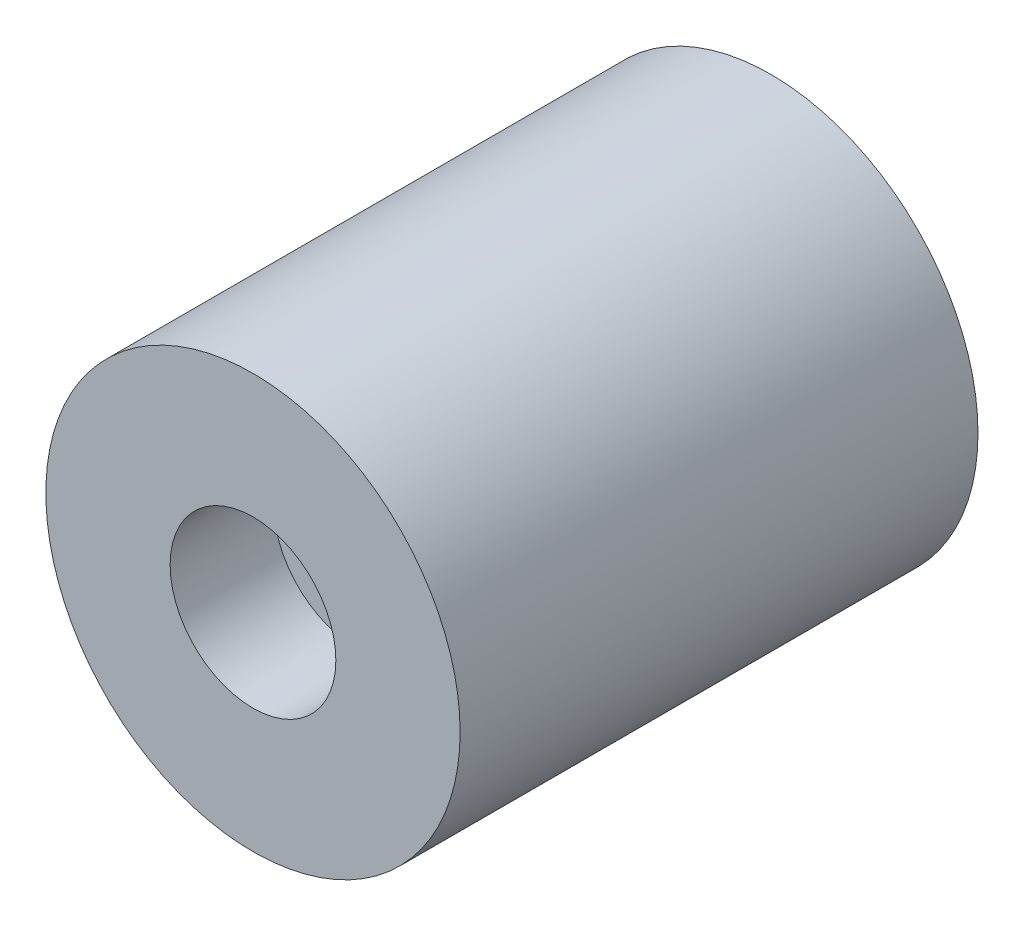
ISO-10303-21;
HEADER;
FILE_DESCRIPTION(('STEP AP214'),'2;1');
FILE_NAME('part.step','',(''),(''),'','','');
FILE_SCHEMA(('AUTOMOTIVE_DESIGN { 1 0 10303 214 1 1 1 1 }'));
ENDSEC;
DATA;
#1=APPLICATION_CONTEXT('core data for automotive mechanical design processes');
#2=APPLICATION_PROTOCOL_DEFINITION('international standard','automotive_design',2000,#1);
#3=PRODUCT_CONTEXT('',#1,'mechanical');
#4=PRODUCT('Part','Part','',(#3));
#5=PRODUCT_RELATED_PRODUCT_CATEGORY('part','',(#4));
#6=PRODUCT_DEFINITION_FORMATION('','',#4);
#7=PRODUCT_DEFINITION_CONTEXT('part definition',#1,'design');
#8=PRODUCT_DEFINITION('design','',#6,#7);
#9=PRODUCT_DEFINITION_SHAPE('','',#8);
#10=(LENGTH_UNIT() NAMED_UNIT(*) SI_UNIT(.MILLI.,.METRE.));
#11=(NAMED_UNIT(*) PLANE_ANGLE_UNIT() SI_UNIT($,.RADIAN.));
#12=(NAMED_UNIT(*) SI_UNIT($,.STERADIAN.) SOLID_ANGLE_UNIT());
#13=UNCERTAINTY_MEASURE_WITH_UNIT(LENGTH_MEASURE(1.E-05),#10,'distance_accuracy_value','');
#14=(GEOMETRIC_REPRESENTATION_CONTEXT(3) GLOBAL_UNCERTAINTY_ASSIGNED_CONTEXT((#13)) GLOBAL_UNIT_ASSIGNED_CONTEXT((#10,
#11,#12)) REPRESENTATION_CONTEXT('',''));
#15=CARTESIAN_POINT('',(0.,0.,0.));
#16=DIRECTION('',(0.,0.,1.));
#17=DIRECTION('',(1.,0.,0.));
#18=AXIS2_PLACEMENT_3D('',#15,#16,#17);
#19=CARTESIAN_POINT('',(0.,0.,-7.5));
#20=DIRECTION('',(0.,0.,1.));
#21=DIRECTION('',(1.,0.,0.));
#22=AXIS2_PLACEMENT_3D('',#19,#20,#21);
#23=PLANE('',#22);
#24=CARTESIAN_POINT('',(0.,0.,-7.5));
#25=DIRECTION('',(0.,0.,1.));
#26=DIRECTION('',(1.,0.,0.));
#27=AXIS2_PLACEMENT_3D('',#24,#25,#26);
#28=CIRCLE('',#27,4.);
#29=CARTESIAN_POINT('',(4.,0.,-7.5));
#30=VERTEX_POINT('',#29);
#31=EDGE_CURVE('E10',#30,#30,#28,.T.);
#32=ORIENTED_EDGE('',*,*,#31,.F.);
#33=EDGE_LOOP('',(#32));
#34=FACE_BOUND('',#33,.T.);
#35=ADVANCED_FACE('F33',(#34),#23,.F.);
#36=CARTESIAN_POINT('',(0.,0.,-12.5));
#37=DIRECTION('',(0.,0.,1.));
#38=DIRECTION('',(1.,0.,0.));
#39=AXIS2_PLACEMENT_3D('',#36,#37,#38);
#40=CYLINDRICAL_SURFACE('',#39,4.);
#41=CARTESIAN_POINT('',(0.,0.,-12.5));
#42=DIRECTION('',(0.,0.,1.));
#43=DIRECTION('',(1.,0.,0.));
#44=AXIS2_PLACEMENT_3D('',#41,#42,#43);
#45=CIRCLE('',#44,4.);
#46=CARTESIAN_POINT('',(4.,0.,-12.5));
#47=VERTEX_POINT('',#46);
#48=EDGE_CURVE('E48',#47,#47,#45,.T.);
#49=ORIENTED_EDGE('',*,*,#48,.F.);
#50=EDGE_LOOP('',(#49));
#51=FACE_BOUND('',#50,.T.);
#52=ORIENTED_EDGE('',*,*,#31,.T.);
#53=EDGE_LOOP('',(#52));
#54=FACE_BOUND('',#53,.T.);
#55=ADVANCED_FACE('F71',(#51,#54),#40,.F.);
#56=CARTESIAN_POINT('',(0.,0.,-12.5));
#57=DIRECTION('',(0.,0.,1.));
#58=DIRECTION('',(1.,0.,0.));
#59=AXIS2_PLACEMENT_3D('',#56,#57,#58);
#60=PLANE('',#59);
#61=ORIENTED_EDGE('',*,*,#48,.T.);
#62=EDGE_LOOP('',(#61));
#63=FACE_BOUND('',#62,.T.);
#64=CARTESIAN_POINT('',(0.,0.,-12.5));
#65=DIRECTION('',(0.,0.,1.));
#66=DIRECTION('',(1.,0.,0.));
#67=AXIS2_PLACEMENT_3D('',#64,#65,#66);
#68=CIRCLE('',#67,10.);
#69=CARTESIAN_POINT('',(10.,0.,-12.5));
#70=VERTEX_POINT('',#69);
#71=EDGE_CURVE('E44',#70,#70,#68,.T.);
#72=ORIENTED_EDGE('',*,*,#71,.F.);
#73=EDGE_LOOP('',(#72));
#74=FACE_BOUND('',#73,.T.);
#75=ADVANCED_FACE('F72',(#63,#74),#60,.F.);
#76=CARTESIAN_POINT('',(0.,0.,-7.5));
#77=DIRECTION('',(0.,0.,1.));
#78=DIRECTION('',(1.,0.,0.));
#79=AXIS2_PLACEMENT_3D('',#76,#77,#78);
#80=CYLINDRICAL_SURFACE('',#79,10.);
#81=CARTESIAN_POINT('',(0.,0.,12.5));
#82=DIRECTION('',(0.,0.,1.));
#83=DIRECTION('',(1.,0.,0.));
#84=AXIS2_PLACEMENT_3D('',#81,#82,#83);
#85=CIRCLE('',#84,10.);
#86=CARTESIAN_POINT('',(10.,0.,12.5));
#87=VERTEX_POINT('',#86);
#88=EDGE_CURVE('E51',#87,#87,#85,.T.);
#89=ORIENTED_EDGE('',*,*,#88,.F.);
#90=EDGE_LOOP('',(#89));
#91=FACE_BOUND('',#90,.T.);
#92=ORIENTED_EDGE('',*,*,#71,.T.);
#93=EDGE_LOOP('',(#92));
#94=FACE_BOUND('',#93,.T.);
#95=ADVANCED_FACE('F35',(#91,#94),#80,.T.);
#96=CARTESIAN_POINT('',(0.,0.,12.5));
#97=DIRECTION('',(0.,0.,1.));
#98=DIRECTION('',(1.,0.,0.));
#99=AXIS2_PLACEMENT_3D('',#96,#97,#98);
#100=PLANE('',#99);
#101=ORIENTED_EDGE('',*,*,#88,.T.);
#102=EDGE_LOOP('',(#101));
#103=FACE_BOUND('',#102,.T.);
#104=CARTESIAN_POINT('',(0.,0.,12.5));
#105=DIRECTION('',(0.,0.,1.));
#106=DIRECTION('',(1.,0.,0.));
#107=AXIS2_PLACEMENT_3D('',#104,#105,#106);
#108=CIRCLE('',#107,4.);
#109=CARTESIAN_POINT('',(4.,0.,12.5));
#110=VERTEX_POINT('',#109);
#111=EDGE_CURVE('E54',#110,#110,#108,.T.);
#112=ORIENTED_EDGE('',*,*,#111,.F.);
#113=EDGE_LOOP('',(#112));
#114=FACE_BOUND('',#113,.T.);
#115=ADVANCED_FACE('F60',(#103,#114),#100,.T.);
#116=CARTESIAN_POINT('',(0.,0.,7.5));
#117=DIRECTION('',(0.,0.,1.));
#118=DIRECTION('',(1.,0.,0.));
#119=AXIS2_PLACEMENT_3D('',#116,#117,#118);
#120=CIRCLE('',#119,4.);
#121=CARTESIAN_POINT('',(4.,0.,7.5));
#122=VERTEX_POINT('',#121);
#123=EDGE_CURVE('E37',#122,#122,#120,.T.);
#124=ORIENTED_EDGE('',*,*,#123,.F.);
#125=EDGE_LOOP('',(#124));
#126=FACE_BOUND('',#125,.T.);
#127=ORIENTED_EDGE('',*,*,#111,.T.);
#128=EDGE_LOOP('',(#127));
#129=FACE_BOUND('',#128,.T.);
#130=ADVANCED_FACE('F58',(#126,#129),#40,.F.);
#131=CARTESIAN_POINT('',(0.,0.,7.5));
#132=DIRECTION('',(0.,0.,1.));
#133=DIRECTION('',(1.,0.,0.));
#134=AXIS2_PLACEMENT_3D('',#131,#132,#133);
#135=PLANE('',#134);
#136=ORIENTED_EDGE('',*,*,#123,.T.);
#137=EDGE_LOOP('',(#136));
#138=FACE_BOUND('',#137,.T.);
#139=ADVANCED_FACE('F68',(#138),#135,.T.);
#140=CLOSED_SHELL('',(#35,#55,#75,#95,#115,#130,#139));
#141=MANIFOLD_SOLID_BREP('B2',#140);
#142=ADVANCED_BREP_SHAPE_REPRESENTATION('',(#18,#141),#14);
#143=SHAPE_DEFINITION_REPRESENTATION(#9,#142);
ENDSEC;
END-ISO-10303-21;
